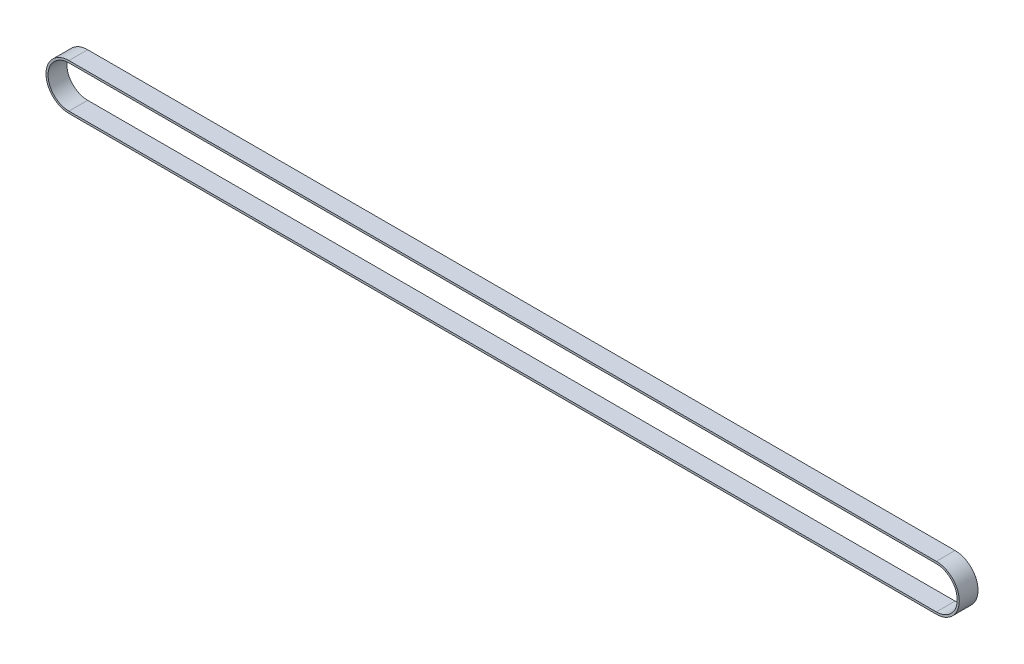
ISO-10303-21;
HEADER;
FILE_DESCRIPTION(('STEP AP214'),'2;1');
FILE_NAME('part.step','',(''),(''),'','','');
FILE_SCHEMA(('AUTOMOTIVE_DESIGN { 1 0 10303 214 1 1 1 1 }'));
ENDSEC;
DATA;
#1=APPLICATION_CONTEXT('core data for automotive mechanical design processes');
#2=APPLICATION_PROTOCOL_DEFINITION('international standard','automotive_design',2000,#1);
#3=PRODUCT_CONTEXT('',#1,'mechanical');
#4=PRODUCT('Part','Part','',(#3));
#5=PRODUCT_RELATED_PRODUCT_CATEGORY('part','',(#4));
#6=PRODUCT_DEFINITION_FORMATION('','',#4);
#7=PRODUCT_DEFINITION_CONTEXT('part definition',#1,'design');
#8=PRODUCT_DEFINITION('design','',#6,#7);
#9=PRODUCT_DEFINITION_SHAPE('','',#8);
#10=(LENGTH_UNIT() NAMED_UNIT(*) SI_UNIT(.MILLI.,.METRE.));
#11=(NAMED_UNIT(*) PLANE_ANGLE_UNIT() SI_UNIT($,.RADIAN.));
#12=(NAMED_UNIT(*) SI_UNIT($,.STERADIAN.) SOLID_ANGLE_UNIT());
#13=UNCERTAINTY_MEASURE_WITH_UNIT(LENGTH_MEASURE(1.E-05),#10,'distance_accuracy_value','');
#14=(GEOMETRIC_REPRESENTATION_CONTEXT(3) GLOBAL_UNCERTAINTY_ASSIGNED_CONTEXT((#13)) GLOBAL_UNIT_ASSIGNED_CONTEXT((#10,
#11,#12)) REPRESENTATION_CONTEXT('',''));
#15=CARTESIAN_POINT('',(0.,0.,0.));
#16=DIRECTION('',(0.,0.,1.));
#17=DIRECTION('',(1.,0.,0.));
#18=AXIS2_PLACEMENT_3D('',#15,#16,#17);
#19=CARTESIAN_POINT('',(-947.748860903948,0.284911899679912,-21.));
#20=DIRECTION('',(0.,0.,1.));
#21=DIRECTION('',(1.,0.,0.));
#22=AXIS2_PLACEMENT_3D('',#19,#20,#21);
#23=CYLINDRICAL_SURFACE('',#22,24.475);
#24=CARTESIAN_POINT('',(-947.748860903948,0.284911899679912,-1.));
#25=DIRECTION('',(0.,0.,-1.));
#26=DIRECTION('',(-1.,0.,0.));
#27=AXIS2_PLACEMENT_3D('',#24,#25,#26);
#28=CIRCLE('',#27,24.475);
#29=CARTESIAN_POINT('',(-947.748860903695,24.7599118996799,-1.));
#30=VERTEX_POINT('',#29);
#31=CARTESIAN_POINT('',(-947.7488609042,-24.1900881003201,-1.));
#32=VERTEX_POINT('',#31);
#33=EDGE_CURVE('E157',#30,#32,#28,.F.);
#34=ORIENTED_EDGE('',*,*,#33,.F.);
#35=DIRECTION('',(0.,0.,1.));
#36=VECTOR('',#35,1.);
#37=CARTESIAN_POINT('',(-947.748860903695,24.7599118996799,-21.));
#38=LINE('',#37,#36);
#39=CARTESIAN_POINT('',(-947.748860903695,24.7599118996799,-21.));
#40=VERTEX_POINT('',#39);
#41=EDGE_CURVE('E12',#40,#30,#38,.T.);
#42=ORIENTED_EDGE('',*,*,#41,.F.);
#43=CARTESIAN_POINT('',(-947.748860903948,0.284911899679912,-21.));
#44=DIRECTION('',(0.,0.,-1.));
#45=DIRECTION('',(-1.,0.,0.));
#46=AXIS2_PLACEMENT_3D('',#43,#44,#45);
#47=CIRCLE('',#46,24.475);
#48=CARTESIAN_POINT('',(-947.7488609042,-24.1900881003201,-21.));
#49=VERTEX_POINT('',#48);
#50=EDGE_CURVE('E161',#40,#49,#47,.F.);
#51=ORIENTED_EDGE('',*,*,#50,.T.);
#52=DIRECTION('',(0.,0.,1.));
#53=VECTOR('',#52,1.);
#54=CARTESIAN_POINT('',(-947.7488609042,-24.1900881003201,-21.));
#55=LINE('',#54,#53);
#56=EDGE_CURVE('E62',#49,#32,#55,.T.);
#57=ORIENTED_EDGE('',*,*,#56,.T.);
#58=EDGE_LOOP('',(#34,#42,#51,#57));
#59=FACE_BOUND('',#58,.T.);
#60=ADVANCED_FACE('F59',(#59),#23,.T.);
#61=CARTESIAN_POINT('',(-947.748860903948,24.7599118996799,-21.));
#62=DIRECTION('',(0.,1.,0.));
#63=DIRECTION('',(0.,0.,1.));
#64=AXIS2_PLACEMENT_3D('',#61,#62,#63);
#65=PLANE('',#64);
#66=DIRECTION('',(-1.,0.,0.));
#67=VECTOR('',#66,1.);
#68=CARTESIAN_POINT('',(-947.748860903948,24.7599118996799,-1.));
#69=LINE('',#68,#67);
#70=CARTESIAN_POINT('',(-21.7488609036879,24.7599118996799,-1.));
#71=VERTEX_POINT('',#70);
#72=EDGE_CURVE('E165',#71,#30,#69,.T.);
#73=ORIENTED_EDGE('',*,*,#72,.F.);
#74=DIRECTION('',(0.,0.,1.));
#75=VECTOR('',#74,1.);
#76=CARTESIAN_POINT('',(-21.7488609036879,24.7599118996799,-21.));
#77=LINE('',#76,#75);
#78=CARTESIAN_POINT('',(-21.7488609036879,24.7599118996799,-21.));
#79=VERTEX_POINT('',#78);
#80=EDGE_CURVE('E67',#79,#71,#77,.T.);
#81=ORIENTED_EDGE('',*,*,#80,.F.);
#82=DIRECTION('',(-1.,0.,0.));
#83=VECTOR('',#82,1.);
#84=CARTESIAN_POINT('',(-947.748860903948,24.7599118996799,-21.));
#85=LINE('',#84,#83);
#86=EDGE_CURVE('E171',#79,#40,#85,.T.);
#87=ORIENTED_EDGE('',*,*,#86,.T.);
#88=ORIENTED_EDGE('',*,*,#41,.T.);
#89=EDGE_LOOP('',(#73,#81,#87,#88));
#90=FACE_BOUND('',#89,.T.);
#91=ADVANCED_FACE('F197',(#90),#65,.T.);
#92=CARTESIAN_POINT('',(-21.7488609039509,0.284911899679913,-21.));
#93=DIRECTION('',(0.,0.,1.));
#94=DIRECTION('',(1.,0.,0.));
#95=AXIS2_PLACEMENT_3D('',#92,#93,#94);
#96=CYLINDRICAL_SURFACE('',#95,24.475);
#97=CARTESIAN_POINT('',(-21.7488609039509,0.284911899679913,-1.));
#98=DIRECTION('',(0.,0.,-1.));
#99=DIRECTION('',(-1.,0.,0.));
#100=AXIS2_PLACEMENT_3D('',#97,#98,#99);
#101=CIRCLE('',#100,24.475);
#102=CARTESIAN_POINT('',(-21.7488609042031,-24.1900881003201,-1.));
#103=VERTEX_POINT('',#102);
#104=EDGE_CURVE('E179',#103,#71,#101,.F.);
#105=ORIENTED_EDGE('',*,*,#104,.F.);
#106=DIRECTION('',(0.,0.,1.));
#107=VECTOR('',#106,1.);
#108=CARTESIAN_POINT('',(-21.7488609042031,-24.1900881003201,-21.));
#109=LINE('',#108,#107);
#110=CARTESIAN_POINT('',(-21.7488609042031,-24.1900881003201,-21.));
#111=VERTEX_POINT('',#110);
#112=EDGE_CURVE('E184',#111,#103,#109,.T.);
#113=ORIENTED_EDGE('',*,*,#112,.F.);
#114=CARTESIAN_POINT('',(-21.7488609039509,0.284911899679913,-21.));
#115=DIRECTION('',(0.,0.,-1.));
#116=DIRECTION('',(-1.,0.,0.));
#117=AXIS2_PLACEMENT_3D('',#114,#115,#116);
#118=CIRCLE('',#117,24.475);
#119=EDGE_CURVE('E168',#111,#79,#118,.F.);
#120=ORIENTED_EDGE('',*,*,#119,.T.);
#121=ORIENTED_EDGE('',*,*,#80,.T.);
#122=EDGE_LOOP('',(#105,#113,#120,#121));
#123=FACE_BOUND('',#122,.T.);
#124=ADVANCED_FACE('F201',(#123),#96,.T.);
#125=CARTESIAN_POINT('',(-947.748860903948,-24.1900881003201,-21.));
#126=DIRECTION('',(0.,-1.,0.));
#127=DIRECTION('',(0.,0.,-1.));
#128=AXIS2_PLACEMENT_3D('',#125,#126,#127);
#129=PLANE('',#128);
#130=DIRECTION('',(1.,0.,0.));
#131=VECTOR('',#130,1.);
#132=CARTESIAN_POINT('',(-947.748860903948,-24.1900881003201,-1.));
#133=LINE('',#132,#131);
#134=EDGE_CURVE('E176',#32,#103,#133,.T.);
#135=ORIENTED_EDGE('',*,*,#134,.F.);
#136=ORIENTED_EDGE('',*,*,#56,.F.);
#137=DIRECTION('',(1.,0.,0.));
#138=VECTOR('',#137,1.);
#139=CARTESIAN_POINT('',(-947.748860903948,-24.1900881003201,-21.));
#140=LINE('',#139,#138);
#141=EDGE_CURVE('E164',#49,#111,#140,.T.);
#142=ORIENTED_EDGE('',*,*,#141,.T.);
#143=ORIENTED_EDGE('',*,*,#112,.T.);
#144=EDGE_LOOP('',(#135,#136,#142,#143));
#145=FACE_BOUND('',#144,.T.);
#146=ADVANCED_FACE('F192',(#145),#129,.T.);
#147=CARTESIAN_POINT('',(-947.748860903948,0.284911899679912,-21.));
#148=DIRECTION('',(0.,0.,-1.));
#149=DIRECTION('',(-1.,0.,0.));
#150=AXIS2_PLACEMENT_3D('',#147,#148,#149);
#151=PLANE('',#150);
#152=CARTESIAN_POINT('',(-947.748860903948,0.284911899679912,-21.));
#153=DIRECTION('',(0.,0.,-1.));
#154=DIRECTION('',(-1.,0.,0.));
#155=AXIS2_PLACEMENT_3D('',#152,#153,#154);
#156=CIRCLE('',#155,22.275);
#157=CARTESIAN_POINT('',(-947.748860903695,22.5599118996799,-21.));
#158=VERTEX_POINT('',#157);
#159=CARTESIAN_POINT('',(-947.7488609042,-21.9900881003201,-21.));
#160=VERTEX_POINT('',#159);
#161=EDGE_CURVE('E126',#158,#160,#156,.F.);
#162=ORIENTED_EDGE('',*,*,#161,.T.);
#163=DIRECTION('',(1.,0.,0.));
#164=VECTOR('',#163,1.);
#165=CARTESIAN_POINT('',(-947.748860903948,-21.9900881003201,-21.));
#166=LINE('',#165,#164);
#167=CARTESIAN_POINT('',(-21.7488609042031,-21.9900881003201,-21.));
#168=VERTEX_POINT('',#167);
#169=EDGE_CURVE('E135',#160,#168,#166,.T.);
#170=ORIENTED_EDGE('',*,*,#169,.T.);
#171=CARTESIAN_POINT('',(-21.7488609039509,0.284911899679913,-21.));
#172=DIRECTION('',(0.,0.,-1.));
#173=DIRECTION('',(-1.,0.,0.));
#174=AXIS2_PLACEMENT_3D('',#171,#172,#173);
#175=CIRCLE('',#174,22.275);
#176=CARTESIAN_POINT('',(-21.7488609037116,22.5599118996799,-21.));
#177=VERTEX_POINT('',#176);
#178=EDGE_CURVE('E75',#168,#177,#175,.F.);
#179=ORIENTED_EDGE('',*,*,#178,.T.);
#180=DIRECTION('',(-1.,0.,0.));
#181=VECTOR('',#180,1.);
#182=CARTESIAN_POINT('',(-947.748860903948,22.5599118996799,-21.));
#183=LINE('',#182,#181);
#184=EDGE_CURVE('E132',#177,#158,#183,.T.);
#185=ORIENTED_EDGE('',*,*,#184,.T.);
#186=EDGE_LOOP('',(#162,#170,#179,#185));
#187=FACE_BOUND('',#186,.T.);
#188=ORIENTED_EDGE('',*,*,#50,.F.);
#189=ORIENTED_EDGE('',*,*,#86,.F.);
#190=ORIENTED_EDGE('',*,*,#119,.F.);
#191=ORIENTED_EDGE('',*,*,#141,.F.);
#192=EDGE_LOOP('',(#188,#189,#190,#191));
#193=FACE_BOUND('',#192,.T.);
#194=ADVANCED_FACE('F139',(#187,#193),#151,.T.);
#195=CARTESIAN_POINT('',(-947.748860903948,0.284911899679912,-1.));
#196=DIRECTION('',(0.,0.,-1.));
#197=DIRECTION('',(-1.,0.,0.));
#198=AXIS2_PLACEMENT_3D('',#195,#196,#197);
#199=PLANE('',#198);
#200=DIRECTION('',(1.,0.,0.));
#201=VECTOR('',#200,1.);
#202=CARTESIAN_POINT('',(-947.748860903948,-21.9900881003201,-1.));
#203=LINE('',#202,#201);
#204=CARTESIAN_POINT('',(-947.7488609042,-21.9900881003201,-1.));
#205=VERTEX_POINT('',#204);
#206=CARTESIAN_POINT('',(-21.7488609042031,-21.9900881003201,-1.));
#207=VERTEX_POINT('',#206);
#208=EDGE_CURVE('E151',#205,#207,#203,.T.);
#209=ORIENTED_EDGE('',*,*,#208,.F.);
#210=CARTESIAN_POINT('',(-947.748860903948,0.284911899679912,-1.));
#211=DIRECTION('',(0.,0.,-1.));
#212=DIRECTION('',(-1.,0.,0.));
#213=AXIS2_PLACEMENT_3D('',#210,#211,#212);
#214=CIRCLE('',#213,22.275);
#215=CARTESIAN_POINT('',(-947.748860903695,22.5599118996799,-1.));
#216=VERTEX_POINT('',#215);
#217=EDGE_CURVE('E83',#216,#205,#214,.F.);
#218=ORIENTED_EDGE('',*,*,#217,.F.);
#219=DIRECTION('',(-1.,0.,0.));
#220=VECTOR('',#219,1.);
#221=CARTESIAN_POINT('',(-947.748860903948,22.5599118996799,-1.));
#222=LINE('',#221,#220);
#223=CARTESIAN_POINT('',(-21.7488609037116,22.5599118996799,-1.));
#224=VERTEX_POINT('',#223);
#225=EDGE_CURVE('E142',#224,#216,#222,.T.);
#226=ORIENTED_EDGE('',*,*,#225,.F.);
#227=CARTESIAN_POINT('',(-21.7488609039509,0.284911899679913,-1.));
#228=DIRECTION('',(0.,0.,-1.));
#229=DIRECTION('',(-1.,0.,0.));
#230=AXIS2_PLACEMENT_3D('',#227,#228,#229);
#231=CIRCLE('',#230,22.275);
#232=EDGE_CURVE('E145',#207,#224,#231,.F.);
#233=ORIENTED_EDGE('',*,*,#232,.F.);
#234=EDGE_LOOP('',(#209,#218,#226,#233));
#235=FACE_BOUND('',#234,.T.);
#236=ORIENTED_EDGE('',*,*,#33,.T.);
#237=ORIENTED_EDGE('',*,*,#134,.T.);
#238=ORIENTED_EDGE('',*,*,#104,.T.);
#239=ORIENTED_EDGE('',*,*,#72,.T.);
#240=EDGE_LOOP('',(#236,#237,#238,#239));
#241=FACE_BOUND('',#240,.T.);
#242=ADVANCED_FACE('F194',(#235,#241),#199,.F.);
#243=CARTESIAN_POINT('',(-947.748860903948,0.284911899679912,-21.));
#244=DIRECTION('',(0.,0.,1.));
#245=DIRECTION('',(1.,0.,0.));
#246=AXIS2_PLACEMENT_3D('',#243,#244,#245);
#247=CYLINDRICAL_SURFACE('',#246,22.275);
#248=ORIENTED_EDGE('',*,*,#217,.T.);
#249=DIRECTION('',(0.,0.,1.));
#250=VECTOR('',#249,1.);
#251=CARTESIAN_POINT('',(-947.7488609042,-21.9900881003201,-21.));
#252=LINE('',#251,#250);
#253=EDGE_CURVE('E122',#160,#205,#252,.T.);
#254=ORIENTED_EDGE('',*,*,#253,.F.);
#255=ORIENTED_EDGE('',*,*,#161,.F.);
#256=DIRECTION('',(0.,0.,1.));
#257=VECTOR('',#256,1.);
#258=CARTESIAN_POINT('',(-947.748860903695,22.5599118996799,-21.));
#259=LINE('',#258,#257);
#260=EDGE_CURVE('E155',#158,#216,#259,.T.);
#261=ORIENTED_EDGE('',*,*,#260,.T.);
#262=EDGE_LOOP('',(#248,#254,#255,#261));
#263=FACE_BOUND('',#262,.T.);
#264=ADVANCED_FACE('F124',(#263),#247,.F.);
#265=CARTESIAN_POINT('',(-947.748860903948,22.5599118996799,-21.));
#266=DIRECTION('',(0.,1.,0.));
#267=DIRECTION('',(0.,0.,1.));
#268=AXIS2_PLACEMENT_3D('',#265,#266,#267);
#269=PLANE('',#268);
#270=ORIENTED_EDGE('',*,*,#225,.T.);
#271=ORIENTED_EDGE('',*,*,#260,.F.);
#272=ORIENTED_EDGE('',*,*,#184,.F.);
#273=DIRECTION('',(0.,0.,1.));
#274=VECTOR('',#273,1.);
#275=CARTESIAN_POINT('',(-21.7488609037116,22.5599118996799,-21.));
#276=LINE('',#275,#274);
#277=EDGE_CURVE('E158',#177,#224,#276,.T.);
#278=ORIENTED_EDGE('',*,*,#277,.T.);
#279=EDGE_LOOP('',(#270,#271,#272,#278));
#280=FACE_BOUND('',#279,.T.);
#281=ADVANCED_FACE('F252',(#280),#269,.F.);
#282=CARTESIAN_POINT('',(-21.7488609039509,0.284911899679913,-21.));
#283=DIRECTION('',(0.,0.,1.));
#284=DIRECTION('',(1.,0.,0.));
#285=AXIS2_PLACEMENT_3D('',#282,#283,#284);
#286=CYLINDRICAL_SURFACE('',#285,22.275);
#287=ORIENTED_EDGE('',*,*,#232,.T.);
#288=ORIENTED_EDGE('',*,*,#277,.F.);
#289=ORIENTED_EDGE('',*,*,#178,.F.);
#290=DIRECTION('',(0.,0.,1.));
#291=VECTOR('',#290,1.);
#292=CARTESIAN_POINT('',(-21.7488609042031,-21.9900881003201,-21.));
#293=LINE('',#292,#291);
#294=EDGE_CURVE('E131',#168,#207,#293,.T.);
#295=ORIENTED_EDGE('',*,*,#294,.T.);
#296=EDGE_LOOP('',(#287,#288,#289,#295));
#297=FACE_BOUND('',#296,.T.);
#298=ADVANCED_FACE('F261',(#297),#286,.F.);
#299=CARTESIAN_POINT('',(-947.748860903948,-21.9900881003201,-21.));
#300=DIRECTION('',(0.,-1.,0.));
#301=DIRECTION('',(0.,0.,-1.));
#302=AXIS2_PLACEMENT_3D('',#299,#300,#301);
#303=PLANE('',#302);
#304=ORIENTED_EDGE('',*,*,#208,.T.);
#305=ORIENTED_EDGE('',*,*,#294,.F.);
#306=ORIENTED_EDGE('',*,*,#169,.F.);
#307=ORIENTED_EDGE('',*,*,#253,.T.);
#308=EDGE_LOOP('',(#304,#305,#306,#307));
#309=FACE_BOUND('',#308,.T.);
#310=ADVANCED_FACE('F136',(#309),#303,.F.);
#311=CLOSED_SHELL('',(#60,#91,#124,#146,#194,#242,#264,#281,#298,#310));
#312=MANIFOLD_SOLID_BREP('B2',#311);
#313=ADVANCED_BREP_SHAPE_REPRESENTATION('',(#18,#312),#14);
#314=SHAPE_DEFINITION_REPRESENTATION(#9,#313);
ENDSEC;
END-ISO-10303-21;
